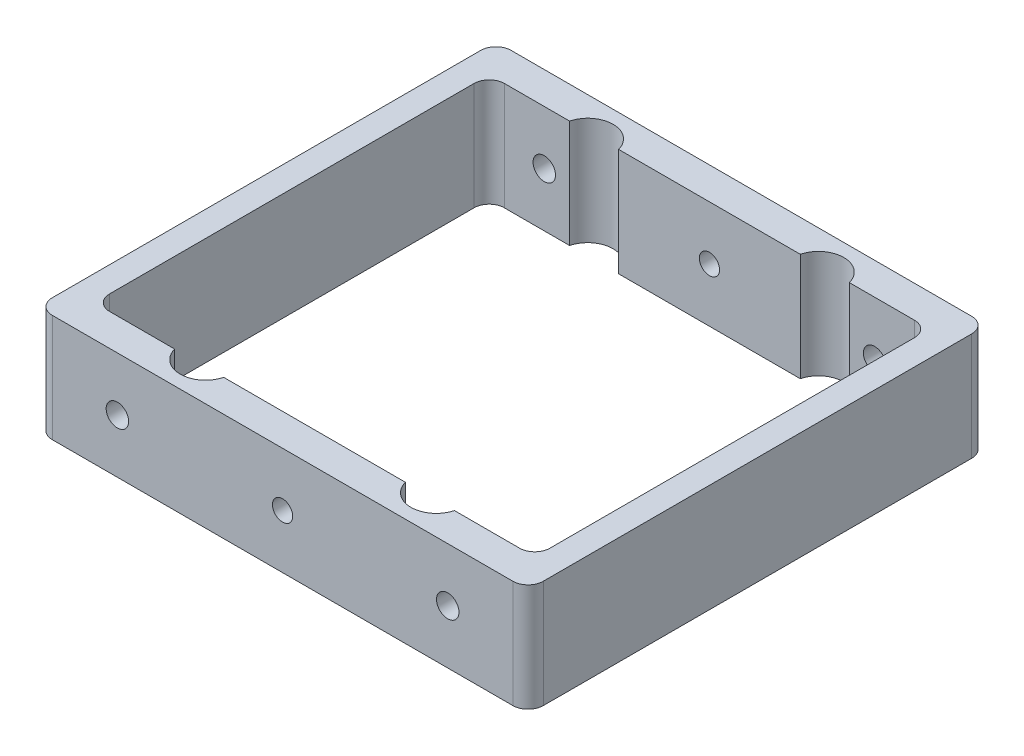
ISO-10303-21;
HEADER;
FILE_DESCRIPTION(('STEP AP214'),'2;1');
FILE_NAME('part.step','',(''),(''),'','','');
FILE_SCHEMA(('AUTOMOTIVE_DESIGN { 1 0 10303 214 1 1 1 1 }'));
ENDSEC;
DATA;
#1=APPLICATION_CONTEXT('core data for automotive mechanical design processes');
#2=APPLICATION_PROTOCOL_DEFINITION('international standard','automotive_design',2000,#1);
#3=PRODUCT_CONTEXT('',#1,'mechanical');
#4=PRODUCT('Part','Part','',(#3));
#5=PRODUCT_RELATED_PRODUCT_CATEGORY('part','',(#4));
#6=PRODUCT_DEFINITION_FORMATION('','',#4);
#7=PRODUCT_DEFINITION_CONTEXT('part definition',#1,'design');
#8=PRODUCT_DEFINITION('design','',#6,#7);
#9=PRODUCT_DEFINITION_SHAPE('','',#8);
#10=(LENGTH_UNIT() NAMED_UNIT(*) SI_UNIT(.MILLI.,.METRE.));
#11=(NAMED_UNIT(*) PLANE_ANGLE_UNIT() SI_UNIT($,.RADIAN.));
#12=(NAMED_UNIT(*) SI_UNIT($,.STERADIAN.) SOLID_ANGLE_UNIT());
#13=UNCERTAINTY_MEASURE_WITH_UNIT(LENGTH_MEASURE(1.E-05),#10,'distance_accuracy_value','');
#14=(GEOMETRIC_REPRESENTATION_CONTEXT(3) GLOBAL_UNCERTAINTY_ASSIGNED_CONTEXT((#13)) GLOBAL_UNIT_ASSIGNED_CONTEXT((#10,
#11,#12)) REPRESENTATION_CONTEXT('',''));
#15=CARTESIAN_POINT('',(0.,0.,0.));
#16=DIRECTION('',(0.,0.,1.));
#17=DIRECTION('',(1.,0.,0.));
#18=AXIS2_PLACEMENT_3D('',#15,#16,#17);
#19=CARTESIAN_POINT('',(-18.5,10.64,-78.01));
#20=DIRECTION('',(0.,0.,-1.));
#21=DIRECTION('',(-1.,0.,0.));
#22=AXIS2_PLACEMENT_3D('',#19,#20,#21);
#23=PLANE('',#22);
#24=CARTESIAN_POINT('',(-2.63122918275928,0.0049999999999998,-78.01));
#25=DIRECTION('',(0.,0.,-1.));
#26=DIRECTION('',(-1.,0.,0.));
#27=AXIS2_PLACEMENT_3D('',#24,#25,#26);
#28=CIRCLE('',#27,2.22000000000001);
#29=CARTESIAN_POINT('',(-4.85122918275928,0.0049999999999998,-78.01));
#30=VERTEX_POINT('',#29);
#31=EDGE_CURVE('E488',#30,#30,#28,.T.);
#32=ORIENTED_EDGE('',*,*,#31,.T.);
#33=EDGE_LOOP('',(#32));
#34=FACE_BOUND('',#33,.T.);
#35=DIRECTION('',(1.,0.,0.));
#36=VECTOR('',#35,1.);
#37=CARTESIAN_POINT('',(-18.5,10.64,-78.01));
#38=LINE('',#37,#36);
#39=CARTESIAN_POINT('',(-10.5,10.64,-78.01));
#40=VERTEX_POINT('',#39);
#41=CARTESIAN_POINT('',(2.36877081724072,10.64,-78.01));
#42=VERTEX_POINT('',#41);
#43=EDGE_CURVE('E256',#40,#42,#38,.T.);
#44=ORIENTED_EDGE('',*,*,#43,.F.);
#45=DIRECTION('',(0.,-1.,0.));
#46=VECTOR('',#45,1.);
#47=CARTESIAN_POINT('',(-10.5,-10.64,-78.01));
#48=LINE('',#47,#46);
#49=CARTESIAN_POINT('',(-10.5,-10.64,-78.01));
#50=VERTEX_POINT('',#49);
#51=EDGE_CURVE('E358',#40,#50,#48,.T.);
#52=ORIENTED_EDGE('',*,*,#51,.T.);
#53=DIRECTION('',(-1.,0.,0.));
#54=VECTOR('',#53,1.);
#55=CARTESIAN_POINT('',(0.,-10.64,-78.01));
#56=LINE('',#55,#54);
#57=CARTESIAN_POINT('',(-18.5,-10.64,-78.01));
#58=VERTEX_POINT('',#57);
#59=EDGE_CURVE('E269',#50,#58,#56,.T.);
#60=ORIENTED_EDGE('',*,*,#59,.T.);
#61=DIRECTION('',(0.,1.,0.));
#62=VECTOR('',#61,1.);
#63=CARTESIAN_POINT('',(-18.5,10.64,-78.01));
#64=LINE('',#63,#62);
#65=CARTESIAN_POINT('',(-18.5,-10.6519547348682,-78.01));
#66=VERTEX_POINT('',#65);
#67=EDGE_CURVE('E254',#66,#58,#64,.T.);
#68=ORIENTED_EDGE('',*,*,#67,.F.);
#69=DIRECTION('',(1.,0.,0.));
#70=VECTOR('',#69,1.);
#71=CARTESIAN_POINT('',(-18.5,-10.6519547348682,-78.01));
#72=LINE('',#71,#70);
#73=CARTESIAN_POINT('',(2.36877081724072,-10.6519547348682,-78.01));
#74=VERTEX_POINT('',#73);
#75=EDGE_CURVE('E265',#66,#74,#72,.T.);
#76=ORIENTED_EDGE('',*,*,#75,.T.);
#77=DIRECTION('',(0.,1.,0.));
#78=VECTOR('',#77,1.);
#79=CARTESIAN_POINT('',(2.36877081724072,-10.6519547348682,-78.01));
#80=LINE('',#79,#78);
#81=EDGE_CURVE('E356',#74,#42,#80,.T.);
#82=ORIENTED_EDGE('',*,*,#81,.T.);
#83=EDGE_LOOP('',(#44,#52,#60,#68,#76,#82));
#84=FACE_BOUND('',#83,.T.);
#85=ADVANCED_FACE('F47',(#34,#84),#23,.F.);
#86=CARTESIAN_POINT('',(30.,0.0049999999999998,-78.01));
#87=DIRECTION('',(0.,0.,-1.));
#88=DIRECTION('',(-1.,0.,0.));
#89=AXIS2_PLACEMENT_3D('',#86,#87,#88);
#90=CIRCLE('',#89,2.);
#91=CARTESIAN_POINT('',(28.,0.0049999999999998,-78.01));
#92=VERTEX_POINT('',#91);
#93=EDGE_CURVE('E505',#92,#92,#90,.T.);
#94=ORIENTED_EDGE('',*,*,#93,.T.);
#95=EDGE_LOOP('',(#94));
#96=FACE_BOUND('',#95,.T.);
#97=CARTESIAN_POINT('',(12.0512291827593,10.64,-78.01));
#98=VERTEX_POINT('',#97);
#99=CARTESIAN_POINT('',(47.9487708172407,10.64,-78.01));
#100=VERTEX_POINT('',#99);
#101=EDGE_CURVE('E247',#98,#100,#38,.T.);
#102=ORIENTED_EDGE('',*,*,#101,.F.);
#103=DIRECTION('',(0.,1.,0.));
#104=VECTOR('',#103,1.);
#105=CARTESIAN_POINT('',(12.0512291827593,-10.6519547348682,-78.01));
#106=LINE('',#105,#104);
#107=CARTESIAN_POINT('',(12.0512291827593,-10.6519547348682,-78.01));
#108=VERTEX_POINT('',#107);
#109=EDGE_CURVE('E353',#98,#108,#106,.F.);
#110=ORIENTED_EDGE('',*,*,#109,.T.);
#111=CARTESIAN_POINT('',(47.9487708172407,-10.6519547348682,-78.01));
#112=VERTEX_POINT('',#111);
#113=EDGE_CURVE('E264',#108,#112,#72,.T.);
#114=ORIENTED_EDGE('',*,*,#113,.T.);
#115=DIRECTION('',(0.,1.,0.));
#116=VECTOR('',#115,1.);
#117=CARTESIAN_POINT('',(47.9487708172407,-10.6519547348682,-78.01));
#118=LINE('',#117,#116);
#119=EDGE_CURVE('E236',#112,#100,#118,.T.);
#120=ORIENTED_EDGE('',*,*,#119,.T.);
#121=EDGE_LOOP('',(#102,#110,#114,#120));
#122=FACE_BOUND('',#121,.T.);
#123=ADVANCED_FACE('F564',(#96,#122),#23,.F.);
#124=CARTESIAN_POINT('',(0.,-10.64,0.));
#125=DIRECTION('',(0.,1.,0.));
#126=DIRECTION('',(0.,0.,1.));
#127=AXIS2_PLACEMENT_3D('',#124,#125,#126);
#128=PLANE('',#127);
#129=DIRECTION('',(1.,0.,0.));
#130=VECTOR('',#129,1.);
#131=CARTESIAN_POINT('',(0.,-10.64,6.32));
#132=LINE('',#131,#130);
#133=CARTESIAN_POINT('',(-15.5,-10.64,6.32));
#134=VERTEX_POINT('',#133);
#135=CARTESIAN_POINT('',(75.5,-10.64,6.32));
#136=VERTEX_POINT('',#135);
#137=EDGE_CURVE('E332',#134,#136,#132,.T.);
#138=ORIENTED_EDGE('',*,*,#137,.F.);
#139=CARTESIAN_POINT('',(-15.5,-10.64,3.32));
#140=DIRECTION('',(0.,1.,0.));
#141=DIRECTION('',(0.,0.,1.));
#142=AXIS2_PLACEMENT_3D('',#139,#140,#141);
#143=CIRCLE('',#142,3.);
#144=CARTESIAN_POINT('',(-18.5,-10.64,3.32));
#145=VERTEX_POINT('',#144);
#146=EDGE_CURVE('E414',#134,#145,#143,.F.);
#147=ORIENTED_EDGE('',*,*,#146,.T.);
#148=DIRECTION('',(0.,0.,1.));
#149=VECTOR('',#148,1.);
#150=CARTESIAN_POINT('',(-18.5,-10.64,0.));
#151=LINE('',#150,#149);
#152=EDGE_CURVE('E304',#58,#145,#151,.T.);
#153=ORIENTED_EDGE('',*,*,#152,.F.);
#154=ORIENTED_EDGE('',*,*,#59,.F.);
#155=CARTESIAN_POINT('',(-10.5,-10.64,-75.01));
#156=DIRECTION('',(0.,1.,0.));
#157=DIRECTION('',(0.,0.,1.));
#158=AXIS2_PLACEMENT_3D('',#155,#156,#157);
#159=CIRCLE('',#158,3.);
#160=CARTESIAN_POINT('',(-13.5,-10.64,-75.01));
#161=VERTEX_POINT('',#160);
#162=EDGE_CURVE('E416',#50,#161,#159,.T.);
#163=ORIENTED_EDGE('',*,*,#162,.T.);
#164=DIRECTION('',(0.,0.,1.));
#165=VECTOR('',#164,1.);
#166=CARTESIAN_POINT('',(-13.5,-10.64,-84.33));
#167=LINE('',#166,#165);
#168=CARTESIAN_POINT('',(-13.5,-10.64,-3.));
#169=VERTEX_POINT('',#168);
#170=EDGE_CURVE('E298',#161,#169,#167,.T.);
#171=ORIENTED_EDGE('',*,*,#170,.T.);
#172=CARTESIAN_POINT('',(-10.5,-10.64,-3.));
#173=DIRECTION('',(0.,1.,0.));
#174=DIRECTION('',(0.,0.,1.));
#175=AXIS2_PLACEMENT_3D('',#172,#173,#174);
#176=CIRCLE('',#175,3.);
#177=CARTESIAN_POINT('',(-10.5,-10.64,0.));
#178=VERTEX_POINT('',#177);
#179=EDGE_CURVE('E420',#169,#178,#176,.T.);
#180=ORIENTED_EDGE('',*,*,#179,.T.);
#181=DIRECTION('',(-1.,0.,0.));
#182=VECTOR('',#181,1.);
#183=CARTESIAN_POINT('',(0.,-10.64,0.));
#184=LINE('',#183,#182);
#185=CARTESIAN_POINT('',(2.36877081724073,-10.64,0.));
#186=VERTEX_POINT('',#185);
#187=EDGE_CURVE('E343',#186,#178,#184,.T.);
#188=ORIENTED_EDGE('',*,*,#187,.F.);
#189=CARTESIAN_POINT('',(7.21,-10.64,-1.25));
#190=DIRECTION('',(0.,1.,0.));
#191=DIRECTION('',(0.,0.,1.));
#192=AXIS2_PLACEMENT_3D('',#189,#190,#191);
#193=CIRCLE('',#192,5.);
#194=CARTESIAN_POINT('',(12.0512291827593,-10.64,0.));
#195=VERTEX_POINT('',#194);
#196=EDGE_CURVE('E237',#186,#195,#193,.T.);
#197=ORIENTED_EDGE('',*,*,#196,.T.);
#198=CARTESIAN_POINT('',(47.9487708172407,-10.64,0.));
#199=VERTEX_POINT('',#198);
#200=EDGE_CURVE('E347',#199,#195,#184,.T.);
#201=ORIENTED_EDGE('',*,*,#200,.F.);
#202=CARTESIAN_POINT('',(52.79,-10.64,-1.25));
#203=DIRECTION('',(0.,1.,0.));
#204=DIRECTION('',(0.,0.,1.));
#205=AXIS2_PLACEMENT_3D('',#202,#203,#204);
#206=CIRCLE('',#205,5.);
#207=CARTESIAN_POINT('',(57.6312291827593,-10.64,0.));
#208=VERTEX_POINT('',#207);
#209=EDGE_CURVE('E340',#199,#208,#206,.T.);
#210=ORIENTED_EDGE('',*,*,#209,.T.);
#211=CARTESIAN_POINT('',(70.5,-10.64,0.));
#212=VERTEX_POINT('',#211);
#213=EDGE_CURVE('E346',#212,#208,#184,.T.);
#214=ORIENTED_EDGE('',*,*,#213,.F.);
#215=CARTESIAN_POINT('',(70.5,-10.64,-3.));
#216=DIRECTION('',(0.,1.,0.));
#217=DIRECTION('',(0.,0.,1.));
#218=AXIS2_PLACEMENT_3D('',#215,#216,#217);
#219=CIRCLE('',#218,3.);
#220=CARTESIAN_POINT('',(73.5,-10.64,-3.));
#221=VERTEX_POINT('',#220);
#222=EDGE_CURVE('E12',#212,#221,#219,.T.);
#223=ORIENTED_EDGE('',*,*,#222,.T.);
#224=DIRECTION('',(0.,0.,-1.));
#225=VECTOR('',#224,1.);
#226=CARTESIAN_POINT('',(73.5,-10.64,0.));
#227=LINE('',#226,#225);
#228=CARTESIAN_POINT('',(73.5,-10.64,0.));
#229=VERTEX_POINT('',#228);
#230=EDGE_CURVE('E61',#229,#221,#227,.T.);
#231=ORIENTED_EDGE('',*,*,#230,.F.);
#232=CARTESIAN_POINT('',(78.5,-10.64,0.));
#233=VERTEX_POINT('',#232);
#234=EDGE_CURVE('E337',#233,#229,#184,.T.);
#235=ORIENTED_EDGE('',*,*,#234,.F.);
#236=DIRECTION('',(0.,0.,-1.));
#237=VECTOR('',#236,1.);
#238=CARTESIAN_POINT('',(78.5,-10.64,6.32));
#239=LINE('',#238,#237);
#240=CARTESIAN_POINT('',(78.5,-10.64,3.32));
#241=VERTEX_POINT('',#240);
#242=EDGE_CURVE('E310',#241,#233,#239,.T.);
#243=ORIENTED_EDGE('',*,*,#242,.F.);
#244=CARTESIAN_POINT('',(75.5,-10.64,3.32));
#245=DIRECTION('',(0.,1.,0.));
#246=DIRECTION('',(0.,0.,1.));
#247=AXIS2_PLACEMENT_3D('',#244,#245,#246);
#248=CIRCLE('',#247,3.);
#249=EDGE_CURVE('E68',#241,#136,#248,.F.);
#250=ORIENTED_EDGE('',*,*,#249,.T.);
#251=EDGE_LOOP('',(#138,#147,#153,#154,#163,#171,#180,#188,#197,#201,#210,#214,#223,#231,#235,
#243,#250));
#252=FACE_BOUND('',#251,.T.);
#253=ADVANCED_FACE('F439',(#252),#128,.F.);
#254=CARTESIAN_POINT('',(-13.5,10.64,-84.33));
#255=DIRECTION('',(-1.,0.,0.));
#256=DIRECTION('',(0.,-1.,0.));
#257=AXIS2_PLACEMENT_3D('',#254,#255,#256);
#258=PLANE('',#257);
#259=ORIENTED_EDGE('',*,*,#170,.F.);
#260=DIRECTION('',(0.,-1.,0.));
#261=VECTOR('',#260,1.);
#262=CARTESIAN_POINT('',(-13.5,10.64,-75.01));
#263=LINE('',#262,#261);
#264=CARTESIAN_POINT('',(-13.5,10.64,-75.01));
#265=VERTEX_POINT('',#264);
#266=EDGE_CURVE('E368',#161,#265,#263,.F.);
#267=ORIENTED_EDGE('',*,*,#266,.T.);
#268=DIRECTION('',(0.,0.,1.));
#269=VECTOR('',#268,1.);
#270=CARTESIAN_POINT('',(-13.5,10.64,-84.33));
#271=LINE('',#270,#269);
#272=CARTESIAN_POINT('',(-13.5,10.64,-3.));
#273=VERTEX_POINT('',#272);
#274=EDGE_CURVE('E301',#265,#273,#271,.T.);
#275=ORIENTED_EDGE('',*,*,#274,.T.);
#276=DIRECTION('',(0.,-1.,0.));
#277=VECTOR('',#276,1.);
#278=CARTESIAN_POINT('',(-13.5,-10.64,-3.));
#279=LINE('',#278,#277);
#280=EDGE_CURVE('E365',#273,#169,#279,.T.);
#281=ORIENTED_EDGE('',*,*,#280,.T.);
#282=EDGE_LOOP('',(#259,#267,#275,#281));
#283=FACE_BOUND('',#282,.T.);
#284=ADVANCED_FACE('F556',(#283),#258,.F.);
#285=CARTESIAN_POINT('',(73.5,10.64,-84.33));
#286=DIRECTION('',(1.,0.,0.));
#287=DIRECTION('',(0.,0.,-1.));
#288=AXIS2_PLACEMENT_3D('',#285,#286,#287);
#289=PLANE('',#288);
#290=DIRECTION('',(0.,0.,1.));
#291=VECTOR('',#290,1.);
#292=CARTESIAN_POINT('',(73.5,10.64,-84.33));
#293=LINE('',#292,#291);
#294=CARTESIAN_POINT('',(73.5,10.64,-75.01));
#295=VERTEX_POINT('',#294);
#296=CARTESIAN_POINT('',(73.5,10.64,-3.));
#297=VERTEX_POINT('',#296);
#298=EDGE_CURVE('E283',#295,#297,#293,.T.);
#299=ORIENTED_EDGE('',*,*,#298,.F.);
#300=DIRECTION('',(0.,1.,0.));
#301=VECTOR('',#300,1.);
#302=CARTESIAN_POINT('',(73.5,-10.6519547348682,-75.01));
#303=LINE('',#302,#301);
#304=CARTESIAN_POINT('',(73.5,-10.6519547348682,-75.01));
#305=VERTEX_POINT('',#304);
#306=EDGE_CURVE('E377',#295,#305,#303,.F.);
#307=ORIENTED_EDGE('',*,*,#306,.T.);
#308=DIRECTION('',(0.,0.,1.));
#309=VECTOR('',#308,1.);
#310=CARTESIAN_POINT('',(73.5,-10.6519547348682,-84.33));
#311=LINE('',#310,#309);
#312=CARTESIAN_POINT('',(73.5,-10.6519547348682,0.));
#313=VERTEX_POINT('',#312);
#314=EDGE_CURVE('E291',#305,#313,#311,.T.);
#315=ORIENTED_EDGE('',*,*,#314,.T.);
#316=DIRECTION('',(0.,1.,0.));
#317=VECTOR('',#316,1.);
#318=CARTESIAN_POINT('',(73.5,10.64,0.));
#319=LINE('',#318,#317);
#320=EDGE_CURVE('E284',#313,#229,#319,.T.);
#321=ORIENTED_EDGE('',*,*,#320,.T.);
#322=ORIENTED_EDGE('',*,*,#230,.T.);
#323=DIRECTION('',(0.,1.,0.));
#324=VECTOR('',#323,1.);
#325=CARTESIAN_POINT('',(73.5,10.64,-3.));
#326=LINE('',#325,#324);
#327=EDGE_CURVE('E374',#221,#297,#326,.T.);
#328=ORIENTED_EDGE('',*,*,#327,.T.);
#329=EDGE_LOOP('',(#299,#307,#315,#321,#322,#328));
#330=FACE_BOUND('',#329,.T.);
#331=ADVANCED_FACE('F441',(#330),#289,.F.);
#332=CARTESIAN_POINT('',(0.,10.64,0.));
#333=DIRECTION('',(0.,0.,1.));
#334=DIRECTION('',(1.,0.,0.));
#335=AXIS2_PLACEMENT_3D('',#332,#333,#334);
#336=PLANE('',#335);
#337=CARTESIAN_POINT('',(62.6312291827593,0.0049999999999998,0.));
#338=DIRECTION('',(0.,0.,1.));
#339=DIRECTION('',(1.,0.,0.));
#340=AXIS2_PLACEMENT_3D('',#337,#338,#339);
#341=CIRCLE('',#340,2.22000000000001);
#342=CARTESIAN_POINT('',(64.8512291827593,0.0049999999999998,0.));
#343=VERTEX_POINT('',#342);
#344=EDGE_CURVE('E362',#343,#343,#341,.T.);
#345=ORIENTED_EDGE('',*,*,#344,.T.);
#346=EDGE_LOOP('',(#345));
#347=FACE_BOUND('',#346,.T.);
#348=DIRECTION('',(-1.,0.,0.));
#349=VECTOR('',#348,1.);
#350=CARTESIAN_POINT('',(0.,10.64,0.));
#351=LINE('',#350,#349);
#352=CARTESIAN_POINT('',(70.5,10.64,0.));
#353=VERTEX_POINT('',#352);
#354=CARTESIAN_POINT('',(57.6312291827593,10.64,0.));
#355=VERTEX_POINT('',#354);
#356=EDGE_CURVE('E338',#353,#355,#351,.T.);
#357=ORIENTED_EDGE('',*,*,#356,.F.);
#358=DIRECTION('',(0.,1.,0.));
#359=VECTOR('',#358,1.);
#360=CARTESIAN_POINT('',(70.5,-10.64,0.));
#361=LINE('',#360,#359);
#362=EDGE_CURVE('E379',#353,#212,#361,.F.);
#363=ORIENTED_EDGE('',*,*,#362,.T.);
#364=ORIENTED_EDGE('',*,*,#213,.T.);
#365=DIRECTION('',(0.,1.,0.));
#366=VECTOR('',#365,1.);
#367=CARTESIAN_POINT('',(57.6312291827593,-10.64,0.));
#368=LINE('',#367,#366);
#369=EDGE_CURVE('E323',#208,#355,#368,.T.);
#370=ORIENTED_EDGE('',*,*,#369,.T.);
#371=EDGE_LOOP('',(#357,#363,#364,#370));
#372=FACE_BOUND('',#371,.T.);
#373=ADVANCED_FACE('F434',(#347,#372),#336,.F.);
#374=CARTESIAN_POINT('',(-2.63122918275928,0.0049999999999998,0.));
#375=DIRECTION('',(0.,0.,1.));
#376=DIRECTION('',(1.,0.,0.));
#377=AXIS2_PLACEMENT_3D('',#374,#375,#376);
#378=CIRCLE('',#377,2.22000000000001);
#379=CARTESIAN_POINT('',(-0.411229182759274,0.0049999999999998,0.));
#380=VERTEX_POINT('',#379);
#381=EDGE_CURVE('E492',#380,#380,#378,.T.);
#382=ORIENTED_EDGE('',*,*,#381,.T.);
#383=EDGE_LOOP('',(#382));
#384=FACE_BOUND('',#383,.T.);
#385=ORIENTED_EDGE('',*,*,#187,.T.);
#386=DIRECTION('',(0.,-1.,0.));
#387=VECTOR('',#386,1.);
#388=CARTESIAN_POINT('',(-10.5,10.64,0.));
#389=LINE('',#388,#387);
#390=CARTESIAN_POINT('',(-10.5,10.64,0.));
#391=VERTEX_POINT('',#390);
#392=EDGE_CURVE('E370',#178,#391,#389,.F.);
#393=ORIENTED_EDGE('',*,*,#392,.T.);
#394=CARTESIAN_POINT('',(2.36877081724073,10.64,0.));
#395=VERTEX_POINT('',#394);
#396=EDGE_CURVE('E336',#395,#391,#351,.T.);
#397=ORIENTED_EDGE('',*,*,#396,.F.);
#398=DIRECTION('',(0.,1.,0.));
#399=VECTOR('',#398,1.);
#400=CARTESIAN_POINT('',(2.36877081724073,-10.64,0.));
#401=LINE('',#400,#399);
#402=EDGE_CURVE('E326',#395,#186,#401,.F.);
#403=ORIENTED_EDGE('',*,*,#402,.T.);
#404=EDGE_LOOP('',(#385,#393,#397,#403));
#405=FACE_BOUND('',#404,.T.);
#406=ADVANCED_FACE('F537',(#384,#405),#336,.F.);
#407=CARTESIAN_POINT('',(30.,0.0049999999999998,0.));
#408=DIRECTION('',(0.,0.,1.));
#409=DIRECTION('',(1.,0.,0.));
#410=AXIS2_PLACEMENT_3D('',#407,#408,#409);
#411=CIRCLE('',#410,2.);
#412=CARTESIAN_POINT('',(32.,0.0049999999999998,0.));
#413=VERTEX_POINT('',#412);
#414=EDGE_CURVE('E515',#413,#413,#411,.T.);
#415=ORIENTED_EDGE('',*,*,#414,.T.);
#416=EDGE_LOOP('',(#415));
#417=FACE_BOUND('',#416,.T.);
#418=ORIENTED_EDGE('',*,*,#200,.T.);
#419=DIRECTION('',(0.,1.,0.));
#420=VECTOR('',#419,1.);
#421=CARTESIAN_POINT('',(12.0512291827593,-10.64,0.));
#422=LINE('',#421,#420);
#423=CARTESIAN_POINT('',(12.0512291827593,10.64,0.));
#424=VERTEX_POINT('',#423);
#425=EDGE_CURVE('E329',#195,#424,#422,.T.);
#426=ORIENTED_EDGE('',*,*,#425,.T.);
#427=CARTESIAN_POINT('',(47.9487708172407,10.64,0.));
#428=VERTEX_POINT('',#427);
#429=EDGE_CURVE('E341',#428,#424,#351,.T.);
#430=ORIENTED_EDGE('',*,*,#429,.F.);
#431=DIRECTION('',(0.,1.,0.));
#432=VECTOR('',#431,1.);
#433=CARTESIAN_POINT('',(47.9487708172407,-10.64,0.));
#434=LINE('',#433,#432);
#435=EDGE_CURVE('E318',#428,#199,#434,.F.);
#436=ORIENTED_EDGE('',*,*,#435,.T.);
#437=EDGE_LOOP('',(#418,#426,#430,#436));
#438=FACE_BOUND('',#437,.T.);
#439=ADVANCED_FACE('F534',(#417,#438),#336,.F.);
#440=CARTESIAN_POINT('',(0.,10.64,6.32));
#441=DIRECTION('',(0.,0.,-1.));
#442=DIRECTION('',(-1.,0.,0.));
#443=AXIS2_PLACEMENT_3D('',#440,#441,#442);
#444=PLANE('',#443);
#445=CARTESIAN_POINT('',(30.,0.0049999999999998,6.32000000000001));
#446=DIRECTION('',(0.,0.,-1.));
#447=DIRECTION('',(-1.,0.,0.));
#448=AXIS2_PLACEMENT_3D('',#445,#446,#447);
#449=CIRCLE('',#448,2.);
#450=CARTESIAN_POINT('',(28.,0.0049999999999998,6.32000000000001));
#451=VERTEX_POINT('',#450);
#452=EDGE_CURVE('E518',#451,#451,#449,.T.);
#453=ORIENTED_EDGE('',*,*,#452,.T.);
#454=EDGE_LOOP('',(#453));
#455=FACE_BOUND('',#454,.T.);
#456=CARTESIAN_POINT('',(62.6312291827593,0.0049999999999998,6.32000000000001));
#457=DIRECTION('',(0.,0.,-1.));
#458=DIRECTION('',(-1.,0.,0.));
#459=AXIS2_PLACEMENT_3D('',#456,#457,#458);
#460=CIRCLE('',#459,2.22000000000001);
#461=CARTESIAN_POINT('',(60.4112291827593,0.0049999999999998,6.32000000000001));
#462=VERTEX_POINT('',#461);
#463=EDGE_CURVE('E363',#462,#462,#460,.T.);
#464=ORIENTED_EDGE('',*,*,#463,.T.);
#465=EDGE_LOOP('',(#464));
#466=FACE_BOUND('',#465,.T.);
#467=CARTESIAN_POINT('',(-2.63122918275928,0.0049999999999998,6.32000000000001));
#468=DIRECTION('',(0.,0.,-1.));
#469=DIRECTION('',(1.,0.,0.));
#470=AXIS2_PLACEMENT_3D('',#467,#468,#469);
#471=CIRCLE('',#470,2.22000000000001);
#472=CARTESIAN_POINT('',(-0.411229182759274,0.0049999999999998,6.32000000000001));
#473=VERTEX_POINT('',#472);
#474=EDGE_CURVE('E501',#473,#473,#471,.T.);
#475=ORIENTED_EDGE('',*,*,#474,.T.);
#476=EDGE_LOOP('',(#475));
#477=FACE_BOUND('',#476,.T.);
#478=DIRECTION('',(1.,0.,0.));
#479=VECTOR('',#478,1.);
#480=CARTESIAN_POINT('',(0.,10.64,6.32));
#481=LINE('',#480,#479);
#482=CARTESIAN_POINT('',(-15.5,10.64,6.32));
#483=VERTEX_POINT('',#482);
#484=CARTESIAN_POINT('',(75.5,10.64,6.32));
#485=VERTEX_POINT('',#484);
#486=EDGE_CURVE('E333',#483,#485,#481,.T.);
#487=ORIENTED_EDGE('',*,*,#486,.F.);
#488=DIRECTION('',(0.,1.,0.));
#489=VECTOR('',#488,1.);
#490=CARTESIAN_POINT('',(-15.5,-10.64,6.32));
#491=LINE('',#490,#489);
#492=EDGE_CURVE('E411',#483,#134,#491,.F.);
#493=ORIENTED_EDGE('',*,*,#492,.T.);
#494=ORIENTED_EDGE('',*,*,#137,.T.);
#495=DIRECTION('',(0.,-1.,0.));
#496=VECTOR('',#495,1.);
#497=CARTESIAN_POINT('',(75.5,10.64,6.32));
#498=LINE('',#497,#496);
#499=EDGE_CURVE('E409',#136,#485,#498,.F.);
#500=ORIENTED_EDGE('',*,*,#499,.T.);
#501=EDGE_LOOP('',(#487,#493,#494,#500));
#502=FACE_BOUND('',#501,.T.);
#503=ADVANCED_FACE('F458',(#455,#466,#477,#502),#444,.F.);
#504=CARTESIAN_POINT('',(0.,10.64,0.));
#505=DIRECTION('',(0.,1.,0.));
#506=DIRECTION('',(0.,0.,1.));
#507=AXIS2_PLACEMENT_3D('',#504,#505,#506);
#508=PLANE('',#507);
#509=CARTESIAN_POINT('',(7.21,10.64,-76.76));
#510=DIRECTION('',(0.,1.,0.));
#511=DIRECTION('',(0.,0.,1.));
#512=AXIS2_PLACEMENT_3D('',#509,#510,#511);
#513=CIRCLE('',#512,5.);
#514=EDGE_CURVE('E248',#98,#42,#513,.T.);
#515=ORIENTED_EDGE('',*,*,#514,.F.);
#516=ORIENTED_EDGE('',*,*,#101,.T.);
#517=CARTESIAN_POINT('',(52.79,10.64,-76.76));
#518=DIRECTION('',(0.,1.,0.));
#519=DIRECTION('',(0.,0.,1.));
#520=AXIS2_PLACEMENT_3D('',#517,#518,#519);
#521=CIRCLE('',#520,5.);
#522=CARTESIAN_POINT('',(57.6312291827593,10.64,-78.01));
#523=VERTEX_POINT('',#522);
#524=EDGE_CURVE('E228',#523,#100,#521,.T.);
#525=ORIENTED_EDGE('',*,*,#524,.F.);
#526=CARTESIAN_POINT('',(70.5,10.64,-78.01));
#527=VERTEX_POINT('',#526);
#528=EDGE_CURVE('E245',#523,#527,#38,.T.);
#529=ORIENTED_EDGE('',*,*,#528,.T.);
#530=CARTESIAN_POINT('',(70.5,10.64,-75.01));
#531=DIRECTION('',(0.,1.,0.));
#532=DIRECTION('',(0.,0.,1.));
#533=AXIS2_PLACEMENT_3D('',#530,#531,#532);
#534=CIRCLE('',#533,3.);
#535=EDGE_CURVE('E424',#527,#295,#534,.F.);
#536=ORIENTED_EDGE('',*,*,#535,.T.);
#537=ORIENTED_EDGE('',*,*,#298,.T.);
#538=CARTESIAN_POINT('',(70.5,10.64,-3.));
#539=DIRECTION('',(0.,1.,0.));
#540=DIRECTION('',(0.,0.,1.));
#541=AXIS2_PLACEMENT_3D('',#538,#539,#540);
#542=CIRCLE('',#541,3.);
#543=EDGE_CURVE('E55',#297,#353,#542,.F.);
#544=ORIENTED_EDGE('',*,*,#543,.T.);
#545=ORIENTED_EDGE('',*,*,#356,.T.);
#546=CARTESIAN_POINT('',(52.79,10.64,-1.25));
#547=DIRECTION('',(0.,1.,0.));
#548=DIRECTION('',(0.,0.,1.));
#549=AXIS2_PLACEMENT_3D('',#546,#547,#548);
#550=CIRCLE('',#549,5.);
#551=EDGE_CURVE('E315',#428,#355,#550,.T.);
#552=ORIENTED_EDGE('',*,*,#551,.F.);
#553=ORIENTED_EDGE('',*,*,#429,.T.);
#554=CARTESIAN_POINT('',(7.21,10.64,-1.25));
#555=DIRECTION('',(0.,1.,0.));
#556=DIRECTION('',(0.,0.,1.));
#557=AXIS2_PLACEMENT_3D('',#554,#555,#556);
#558=CIRCLE('',#557,5.);
#559=EDGE_CURVE('E316',#395,#424,#558,.T.);
#560=ORIENTED_EDGE('',*,*,#559,.F.);
#561=ORIENTED_EDGE('',*,*,#396,.T.);
#562=CARTESIAN_POINT('',(-10.5,10.64,-3.));
#563=DIRECTION('',(0.,1.,0.));
#564=DIRECTION('',(0.,0.,1.));
#565=AXIS2_PLACEMENT_3D('',#562,#563,#564);
#566=CIRCLE('',#565,3.);
#567=EDGE_CURVE('E422',#391,#273,#566,.F.);
#568=ORIENTED_EDGE('',*,*,#567,.T.);
#569=ORIENTED_EDGE('',*,*,#274,.F.);
#570=CARTESIAN_POINT('',(-10.5,10.64,-75.01));
#571=DIRECTION('',(0.,1.,0.));
#572=DIRECTION('',(0.,0.,1.));
#573=AXIS2_PLACEMENT_3D('',#570,#571,#572);
#574=CIRCLE('',#573,3.);
#575=EDGE_CURVE('E418',#265,#40,#574,.F.);
#576=ORIENTED_EDGE('',*,*,#575,.T.);
#577=ORIENTED_EDGE('',*,*,#43,.T.);
#578=EDGE_LOOP('',(#515,#516,#525,#529,#536,#537,#544,#545,#552,#553,#560,#561,#568,#569,#576,#577));
#579=FACE_BOUND('',#578,.T.);
#580=DIRECTION('',(0.,0.,1.));
#581=VECTOR('',#580,1.);
#582=CARTESIAN_POINT('',(78.5,10.64,6.32));
#583=LINE('',#582,#581);
#584=CARTESIAN_POINT('',(78.5,10.64,-81.33));
#585=VERTEX_POINT('',#584);
#586=CARTESIAN_POINT('',(78.5,10.64,3.32));
#587=VERTEX_POINT('',#586);
#588=EDGE_CURVE('E312',#585,#587,#583,.T.);
#589=ORIENTED_EDGE('',*,*,#588,.F.);
#590=CARTESIAN_POINT('',(75.5,10.64,-81.33));
#591=DIRECTION('',(0.,1.,0.));
#592=DIRECTION('',(0.,0.,1.));
#593=AXIS2_PLACEMENT_3D('',#590,#591,#592);
#594=CIRCLE('',#593,3.);
#595=CARTESIAN_POINT('',(75.5,10.64,-84.33));
#596=VERTEX_POINT('',#595);
#597=EDGE_CURVE('E402',#585,#596,#594,.T.);
#598=ORIENTED_EDGE('',*,*,#597,.T.);
#599=DIRECTION('',(1.,0.,0.));
#600=VECTOR('',#599,1.);
#601=CARTESIAN_POINT('',(-18.5,10.64,-84.33));
#602=LINE('',#601,#600);
#603=CARTESIAN_POINT('',(-15.5,10.64,-84.33));
#604=VERTEX_POINT('',#603);
#605=EDGE_CURVE('E295',#604,#596,#602,.T.);
#606=ORIENTED_EDGE('',*,*,#605,.F.);
#607=CARTESIAN_POINT('',(-15.5,10.64,-81.33));
#608=DIRECTION('',(0.,1.,0.));
#609=DIRECTION('',(0.,0.,1.));
#610=AXIS2_PLACEMENT_3D('',#607,#608,#609);
#611=CIRCLE('',#610,3.);
#612=CARTESIAN_POINT('',(-18.5,10.64,-81.33));
#613=VERTEX_POINT('',#612);
#614=EDGE_CURVE('E400',#604,#613,#611,.T.);
#615=ORIENTED_EDGE('',*,*,#614,.T.);
#616=DIRECTION('',(0.,0.,-1.));
#617=VECTOR('',#616,1.);
#618=CARTESIAN_POINT('',(-18.5,10.64,0.));
#619=LINE('',#618,#617);
#620=CARTESIAN_POINT('',(-18.5,10.64,3.32));
#621=VERTEX_POINT('',#620);
#622=EDGE_CURVE('E307',#621,#613,#619,.T.);
#623=ORIENTED_EDGE('',*,*,#622,.F.);
#624=CARTESIAN_POINT('',(-15.5,10.64,3.32));
#625=DIRECTION('',(0.,1.,0.));
#626=DIRECTION('',(0.,0.,1.));
#627=AXIS2_PLACEMENT_3D('',#624,#625,#626);
#628=CIRCLE('',#627,3.);
#629=EDGE_CURVE('E398',#621,#483,#628,.T.);
#630=ORIENTED_EDGE('',*,*,#629,.T.);
#631=ORIENTED_EDGE('',*,*,#486,.T.);
#632=CARTESIAN_POINT('',(75.5,10.64,3.32));
#633=DIRECTION('',(0.,1.,0.));
#634=DIRECTION('',(0.,0.,1.));
#635=AXIS2_PLACEMENT_3D('',#632,#633,#634);
#636=CIRCLE('',#635,3.);
#637=EDGE_CURVE('E396',#485,#587,#636,.T.);
#638=ORIENTED_EDGE('',*,*,#637,.T.);
#639=EDGE_LOOP('',(#589,#598,#606,#615,#623,#630,#631,#638));
#640=FACE_BOUND('',#639,.T.);
#641=ADVANCED_FACE('F243',(#579,#640),#508,.T.);
#642=CARTESIAN_POINT('',(52.79,-10.64,-1.25));
#643=DIRECTION('',(0.,1.,0.));
#644=DIRECTION('',(0.,0.,1.));
#645=AXIS2_PLACEMENT_3D('',#642,#643,#644);
#646=CYLINDRICAL_SURFACE('',#645,5.);
#647=ORIENTED_EDGE('',*,*,#209,.F.);
#648=ORIENTED_EDGE('',*,*,#435,.F.);
#649=ORIENTED_EDGE('',*,*,#551,.T.);
#650=ORIENTED_EDGE('',*,*,#369,.F.);
#651=EDGE_LOOP('',(#647,#648,#649,#650));
#652=FACE_BOUND('',#651,.T.);
#653=ADVANCED_FACE('F677',(#652),#646,.F.);
#654=CARTESIAN_POINT('',(7.21,-10.64,-1.25));
#655=DIRECTION('',(0.,1.,0.));
#656=DIRECTION('',(0.,0.,1.));
#657=AXIS2_PLACEMENT_3D('',#654,#655,#656);
#658=CYLINDRICAL_SURFACE('',#657,5.);
#659=ORIENTED_EDGE('',*,*,#196,.F.);
#660=ORIENTED_EDGE('',*,*,#402,.F.);
#661=ORIENTED_EDGE('',*,*,#559,.T.);
#662=ORIENTED_EDGE('',*,*,#425,.F.);
#663=EDGE_LOOP('',(#659,#660,#661,#662));
#664=FACE_BOUND('',#663,.T.);
#665=ADVANCED_FACE('F672',(#664),#658,.F.);
#666=CARTESIAN_POINT('',(78.5,0.,0.));
#667=DIRECTION('',(1.,0.,0.));
#668=DIRECTION('',(0.,0.,-1.));
#669=AXIS2_PLACEMENT_3D('',#666,#667,#668);
#670=PLANE('',#669);
#671=DIRECTION('',(0.,0.,1.));
#672=VECTOR('',#671,1.);
#673=CARTESIAN_POINT('',(78.5,-10.6519547348682,-84.33));
#674=LINE('',#673,#672);
#675=CARTESIAN_POINT('',(78.5,-10.6519547348682,-81.33));
#676=VERTEX_POINT('',#675);
#677=CARTESIAN_POINT('',(78.5,-10.6519547348682,0.));
#678=VERTEX_POINT('',#677);
#679=EDGE_CURVE('E293',#676,#678,#674,.T.);
#680=ORIENTED_EDGE('',*,*,#679,.F.);
#681=DIRECTION('',(0.,-1.,0.));
#682=VECTOR('',#681,1.);
#683=CARTESIAN_POINT('',(78.5,10.64,-81.33));
#684=LINE('',#683,#682);
#685=EDGE_CURVE('E394',#676,#585,#684,.F.);
#686=ORIENTED_EDGE('',*,*,#685,.T.);
#687=ORIENTED_EDGE('',*,*,#588,.T.);
#688=DIRECTION('',(0.,-1.,0.));
#689=VECTOR('',#688,1.);
#690=CARTESIAN_POINT('',(78.5,-10.64,3.32));
#691=LINE('',#690,#689);
#692=EDGE_CURVE('E391',#587,#241,#691,.T.);
#693=ORIENTED_EDGE('',*,*,#692,.T.);
#694=ORIENTED_EDGE('',*,*,#242,.T.);
#695=DIRECTION('',(0.,-1.,0.));
#696=VECTOR('',#695,1.);
#697=CARTESIAN_POINT('',(78.5,10.64,0.));
#698=LINE('',#697,#696);
#699=EDGE_CURVE('E275',#233,#678,#698,.T.);
#700=ORIENTED_EDGE('',*,*,#699,.T.);
#701=EDGE_LOOP('',(#680,#686,#687,#693,#694,#700));
#702=FACE_BOUND('',#701,.T.);
#703=ADVANCED_FACE('F450',(#702),#670,.T.);
#704=CARTESIAN_POINT('',(-18.5,0.,0.));
#705=DIRECTION('',(-1.,0.,0.));
#706=DIRECTION('',(0.,0.,1.));
#707=AXIS2_PLACEMENT_3D('',#704,#705,#706);
#708=PLANE('',#707);
#709=ORIENTED_EDGE('',*,*,#622,.T.);
#710=DIRECTION('',(0.,1.,0.));
#711=VECTOR('',#710,1.);
#712=CARTESIAN_POINT('',(-18.5,-10.6519547348682,-81.33));
#713=LINE('',#712,#711);
#714=CARTESIAN_POINT('',(-18.5,-10.6519547348682,-81.33));
#715=VERTEX_POINT('',#714);
#716=EDGE_CURVE('E407',#613,#715,#713,.F.);
#717=ORIENTED_EDGE('',*,*,#716,.T.);
#718=DIRECTION('',(0.,0.,1.));
#719=VECTOR('',#718,1.);
#720=CARTESIAN_POINT('',(-18.5,-10.6519547348682,-84.33));
#721=LINE('',#720,#719);
#722=EDGE_CURVE('E258',#715,#66,#721,.T.);
#723=ORIENTED_EDGE('',*,*,#722,.T.);
#724=ORIENTED_EDGE('',*,*,#67,.T.);
#725=ORIENTED_EDGE('',*,*,#152,.T.);
#726=DIRECTION('',(0.,1.,0.));
#727=VECTOR('',#726,1.);
#728=CARTESIAN_POINT('',(-18.5,10.64,3.32));
#729=LINE('',#728,#727);
#730=EDGE_CURVE('E404',#145,#621,#729,.T.);
#731=ORIENTED_EDGE('',*,*,#730,.T.);
#732=EDGE_LOOP('',(#709,#717,#723,#724,#725,#731));
#733=FACE_BOUND('',#732,.T.);
#734=ADVANCED_FACE('F466',(#733),#708,.T.);
#735=CARTESIAN_POINT('',(0.,0.,-84.33));
#736=DIRECTION('',(0.,0.,1.));
#737=DIRECTION('',(1.,0.,0.));
#738=AXIS2_PLACEMENT_3D('',#735,#736,#737);
#739=PLANE('',#738);
#740=CARTESIAN_POINT('',(30.,0.0049999999999998,-84.33));
#741=DIRECTION('',(0.,0.,-1.));
#742=DIRECTION('',(-1.,0.,0.));
#743=AXIS2_PLACEMENT_3D('',#740,#741,#742);
#744=CIRCLE('',#743,2.);
#745=CARTESIAN_POINT('',(28.,0.0049999999999998,-84.33));
#746=VERTEX_POINT('',#745);
#747=EDGE_CURVE('E519',#746,#746,#744,.T.);
#748=ORIENTED_EDGE('',*,*,#747,.F.);
#749=EDGE_LOOP('',(#748));
#750=FACE_BOUND('',#749,.T.);
#751=CARTESIAN_POINT('',(62.6312291827593,0.0049999999999998,-84.33));
#752=DIRECTION('',(0.,0.,-1.));
#753=DIRECTION('',(-1.,0.,0.));
#754=AXIS2_PLACEMENT_3D('',#751,#752,#753);
#755=CIRCLE('',#754,2.22000000000001);
#756=CARTESIAN_POINT('',(60.4112291827593,0.0049999999999998,-84.33));
#757=VERTEX_POINT('',#756);
#758=EDGE_CURVE('E508',#757,#757,#755,.T.);
#759=ORIENTED_EDGE('',*,*,#758,.F.);
#760=EDGE_LOOP('',(#759));
#761=FACE_BOUND('',#760,.T.);
#762=CARTESIAN_POINT('',(-2.63122918275928,0.0049999999999998,-84.33));
#763=DIRECTION('',(0.,0.,-1.));
#764=DIRECTION('',(1.,0.,0.));
#765=AXIS2_PLACEMENT_3D('',#762,#763,#764);
#766=CIRCLE('',#765,2.22000000000001);
#767=CARTESIAN_POINT('',(-0.411229182759274,0.0049999999999998,-84.33));
#768=VERTEX_POINT('',#767);
#769=EDGE_CURVE('E504',#768,#768,#766,.T.);
#770=ORIENTED_EDGE('',*,*,#769,.F.);
#771=EDGE_LOOP('',(#770));
#772=FACE_BOUND('',#771,.T.);
#773=ORIENTED_EDGE('',*,*,#605,.T.);
#774=DIRECTION('',(0.,-1.,0.));
#775=VECTOR('',#774,1.);
#776=CARTESIAN_POINT('',(75.5,-10.6519547348682,-84.33));
#777=LINE('',#776,#775);
#778=CARTESIAN_POINT('',(75.5,-10.6519547348682,-84.33));
#779=VERTEX_POINT('',#778);
#780=EDGE_CURVE('E384',#596,#779,#777,.T.);
#781=ORIENTED_EDGE('',*,*,#780,.T.);
#782=DIRECTION('',(-1.,0.,0.));
#783=VECTOR('',#782,1.);
#784=CARTESIAN_POINT('',(78.5,-10.6519547348682,-84.33));
#785=LINE('',#784,#783);
#786=CARTESIAN_POINT('',(-15.5,-10.6519547348682,-84.33));
#787=VERTEX_POINT('',#786);
#788=EDGE_CURVE('E281',#779,#787,#785,.T.);
#789=ORIENTED_EDGE('',*,*,#788,.T.);
#790=DIRECTION('',(0.,1.,0.));
#791=VECTOR('',#790,1.);
#792=CARTESIAN_POINT('',(-15.5,10.64,-84.33));
#793=LINE('',#792,#791);
#794=EDGE_CURVE('E381',#787,#604,#793,.T.);
#795=ORIENTED_EDGE('',*,*,#794,.T.);
#796=EDGE_LOOP('',(#773,#781,#789,#795));
#797=FACE_BOUND('',#796,.T.);
#798=ADVANCED_FACE('F650',(#750,#761,#772,#797),#739,.F.);
#799=CARTESIAN_POINT('',(0.,0.,0.));
#800=DIRECTION('',(0.,0.,-1.));
#801=DIRECTION('',(-1.,0.,0.));
#802=AXIS2_PLACEMENT_3D('',#799,#800,#801);
#803=PLANE('',#802);
#804=ORIENTED_EDGE('',*,*,#699,.F.);
#805=ORIENTED_EDGE('',*,*,#234,.T.);
#806=ORIENTED_EDGE('',*,*,#320,.F.);
#807=DIRECTION('',(-1.,0.,0.));
#808=VECTOR('',#807,1.);
#809=CARTESIAN_POINT('',(78.5,-10.6519547348682,0.));
#810=LINE('',#809,#808);
#811=EDGE_CURVE('E278',#678,#313,#810,.T.);
#812=ORIENTED_EDGE('',*,*,#811,.F.);
#813=EDGE_LOOP('',(#804,#805,#806,#812));
#814=FACE_BOUND('',#813,.T.);
#815=ADVANCED_FACE('F447',(#814),#803,.F.);
#816=CARTESIAN_POINT('',(78.5,-10.6519547348682,-84.33));
#817=DIRECTION('',(0.,1.,0.));
#818=DIRECTION('',(0.,0.,1.));
#819=AXIS2_PLACEMENT_3D('',#816,#817,#818);
#820=PLANE('',#819);
#821=ORIENTED_EDGE('',*,*,#788,.F.);
#822=CARTESIAN_POINT('',(75.5,-10.6519547348682,-81.33));
#823=DIRECTION('',(0.,1.,0.));
#824=DIRECTION('',(0.,0.,1.));
#825=AXIS2_PLACEMENT_3D('',#822,#823,#824);
#826=CIRCLE('',#825,3.);
#827=EDGE_CURVE('E389',#779,#676,#826,.F.);
#828=ORIENTED_EDGE('',*,*,#827,.T.);
#829=ORIENTED_EDGE('',*,*,#679,.T.);
#830=ORIENTED_EDGE('',*,*,#811,.T.);
#831=ORIENTED_EDGE('',*,*,#314,.F.);
#832=CARTESIAN_POINT('',(70.5,-10.6519547348682,-75.01));
#833=DIRECTION('',(0.,1.,0.));
#834=DIRECTION('',(0.,0.,1.));
#835=AXIS2_PLACEMENT_3D('',#832,#833,#834);
#836=CIRCLE('',#835,3.);
#837=CARTESIAN_POINT('',(70.5,-10.6519547348682,-78.01));
#838=VERTEX_POINT('',#837);
#839=EDGE_CURVE('E426',#305,#838,#836,.T.);
#840=ORIENTED_EDGE('',*,*,#839,.T.);
#841=CARTESIAN_POINT('',(57.6312291827593,-10.6519547348682,-78.01));
#842=VERTEX_POINT('',#841);
#843=EDGE_CURVE('E261',#842,#838,#72,.T.);
#844=ORIENTED_EDGE('',*,*,#843,.F.);
#845=CARTESIAN_POINT('',(52.79,-10.6519547348682,-76.76));
#846=DIRECTION('',(0.,1.,0.));
#847=DIRECTION('',(0.,0.,1.));
#848=AXIS2_PLACEMENT_3D('',#845,#846,#847);
#849=CIRCLE('',#848,5.);
#850=EDGE_CURVE('E231',#842,#112,#849,.T.);
#851=ORIENTED_EDGE('',*,*,#850,.T.);
#852=ORIENTED_EDGE('',*,*,#113,.F.);
#853=CARTESIAN_POINT('',(7.21,-10.6519547348682,-76.76));
#854=DIRECTION('',(0.,1.,0.));
#855=DIRECTION('',(0.,0.,1.));
#856=AXIS2_PLACEMENT_3D('',#853,#854,#855);
#857=CIRCLE('',#856,5.);
#858=EDGE_CURVE('E478',#108,#74,#857,.T.);
#859=ORIENTED_EDGE('',*,*,#858,.T.);
#860=ORIENTED_EDGE('',*,*,#75,.F.);
#861=ORIENTED_EDGE('',*,*,#722,.F.);
#862=CARTESIAN_POINT('',(-15.5,-10.6519547348682,-81.33));
#863=DIRECTION('',(0.,1.,0.));
#864=DIRECTION('',(0.,0.,1.));
#865=AXIS2_PLACEMENT_3D('',#862,#863,#864);
#866=CIRCLE('',#865,3.);
#867=EDGE_CURVE('E387',#715,#787,#866,.F.);
#868=ORIENTED_EDGE('',*,*,#867,.T.);
#869=EDGE_LOOP('',(#821,#828,#829,#830,#831,#840,#844,#851,#852,#859,#860,#861,#868));
#870=FACE_BOUND('',#869,.T.);
#871=ADVANCED_FACE('F482',(#870),#820,.F.);
#872=CARTESIAN_POINT('',(62.6312291827593,0.0049999999999998,-78.01));
#873=DIRECTION('',(0.,0.,-1.));
#874=DIRECTION('',(-1.,0.,0.));
#875=AXIS2_PLACEMENT_3D('',#872,#873,#874);
#876=CIRCLE('',#875,2.22000000000001);
#877=CARTESIAN_POINT('',(60.4112291827593,0.0049999999999998,-78.01));
#878=VERTEX_POINT('',#877);
#879=EDGE_CURVE('E359',#878,#878,#876,.T.);
#880=ORIENTED_EDGE('',*,*,#879,.T.);
#881=EDGE_LOOP('',(#880));
#882=FACE_BOUND('',#881,.T.);
#883=ORIENTED_EDGE('',*,*,#843,.T.);
#884=DIRECTION('',(0.,1.,0.));
#885=VECTOR('',#884,1.);
#886=CARTESIAN_POINT('',(70.5,10.64,-78.01));
#887=LINE('',#886,#885);
#888=EDGE_CURVE('E253',#838,#527,#887,.T.);
#889=ORIENTED_EDGE('',*,*,#888,.T.);
#890=ORIENTED_EDGE('',*,*,#528,.F.);
#891=DIRECTION('',(0.,1.,0.));
#892=VECTOR('',#891,1.);
#893=CARTESIAN_POINT('',(57.6312291827593,-10.6519547348682,-78.01));
#894=LINE('',#893,#892);
#895=EDGE_CURVE('E225',#523,#842,#894,.F.);
#896=ORIENTED_EDGE('',*,*,#895,.T.);
#897=EDGE_LOOP('',(#883,#889,#890,#896));
#898=FACE_BOUND('',#897,.T.);
#899=ADVANCED_FACE('F251',(#882,#898),#23,.F.);
#900=CARTESIAN_POINT('',(52.79,-10.6519547348682,-76.76));
#901=DIRECTION('',(0.,1.,0.));
#902=DIRECTION('',(0.,0.,1.));
#903=AXIS2_PLACEMENT_3D('',#900,#901,#902);
#904=CYLINDRICAL_SURFACE('',#903,5.);
#905=ORIENTED_EDGE('',*,*,#850,.F.);
#906=ORIENTED_EDGE('',*,*,#895,.F.);
#907=ORIENTED_EDGE('',*,*,#524,.T.);
#908=ORIENTED_EDGE('',*,*,#119,.F.);
#909=EDGE_LOOP('',(#905,#906,#907,#908));
#910=FACE_BOUND('',#909,.T.);
#911=ADVANCED_FACE('F227',(#910),#904,.F.);
#912=CARTESIAN_POINT('',(7.21,-10.6519547348682,-76.76));
#913=DIRECTION('',(0.,1.,0.));
#914=DIRECTION('',(0.,0.,1.));
#915=AXIS2_PLACEMENT_3D('',#912,#913,#914);
#916=CYLINDRICAL_SURFACE('',#915,5.);
#917=ORIENTED_EDGE('',*,*,#858,.F.);
#918=ORIENTED_EDGE('',*,*,#109,.F.);
#919=ORIENTED_EDGE('',*,*,#514,.T.);
#920=ORIENTED_EDGE('',*,*,#81,.F.);
#921=EDGE_LOOP('',(#917,#918,#919,#920));
#922=FACE_BOUND('',#921,.T.);
#923=ADVANCED_FACE('F477',(#922),#916,.F.);
#924=CARTESIAN_POINT('',(62.6312291827593,0.0049999999999998,6.32000000000001));
#925=DIRECTION('',(0.,0.,-1.));
#926=DIRECTION('',(-1.,0.,0.));
#927=AXIS2_PLACEMENT_3D('',#924,#925,#926);
#928=CYLINDRICAL_SURFACE('',#927,2.22000000000001);
#929=ORIENTED_EDGE('',*,*,#758,.T.);
#930=EDGE_LOOP('',(#929));
#931=FACE_BOUND('',#930,.T.);
#932=ORIENTED_EDGE('',*,*,#879,.F.);
#933=EDGE_LOOP('',(#932));
#934=FACE_BOUND('',#933,.T.);
#935=ADVANCED_FACE('F587',(#931,#934),#928,.F.);
#936=CARTESIAN_POINT('',(-2.63122918275928,0.0049999999999998,6.32000000000001));
#937=DIRECTION('',(0.,0.,-1.));
#938=DIRECTION('',(-1.,0.,0.));
#939=AXIS2_PLACEMENT_3D('',#936,#937,#938);
#940=CYLINDRICAL_SURFACE('',#939,2.22000000000001);
#941=ORIENTED_EDGE('',*,*,#769,.T.);
#942=EDGE_LOOP('',(#941));
#943=FACE_BOUND('',#942,.T.);
#944=ORIENTED_EDGE('',*,*,#31,.F.);
#945=EDGE_LOOP('',(#944));
#946=FACE_BOUND('',#945,.T.);
#947=ADVANCED_FACE('F589',(#943,#946),#940,.F.);
#948=ORIENTED_EDGE('',*,*,#474,.F.);
#949=EDGE_LOOP('',(#948));
#950=FACE_BOUND('',#949,.T.);
#951=ORIENTED_EDGE('',*,*,#381,.F.);
#952=EDGE_LOOP('',(#951));
#953=FACE_BOUND('',#952,.T.);
#954=ADVANCED_FACE('F597',(#950,#953),#940,.F.);
#955=ORIENTED_EDGE('',*,*,#463,.F.);
#956=EDGE_LOOP('',(#955));
#957=FACE_BOUND('',#956,.T.);
#958=ORIENTED_EDGE('',*,*,#344,.F.);
#959=EDGE_LOOP('',(#958));
#960=FACE_BOUND('',#959,.T.);
#961=ADVANCED_FACE('F592',(#957,#960),#928,.F.);
#962=CARTESIAN_POINT('',(-10.5,10.64,-75.01));
#963=DIRECTION('',(0.,1.,0.));
#964=DIRECTION('',(-1.,0.,0.));
#965=AXIS2_PLACEMENT_3D('',#962,#963,#964);
#966=CYLINDRICAL_SURFACE('',#965,3.);
#967=ORIENTED_EDGE('',*,*,#575,.F.);
#968=ORIENTED_EDGE('',*,*,#266,.F.);
#969=ORIENTED_EDGE('',*,*,#162,.F.);
#970=ORIENTED_EDGE('',*,*,#51,.F.);
#971=EDGE_LOOP('',(#967,#968,#969,#970));
#972=FACE_BOUND('',#971,.T.);
#973=ADVANCED_FACE('F474',(#972),#966,.F.);
#974=CARTESIAN_POINT('',(-10.5,10.64,-3.));
#975=DIRECTION('',(0.,1.,0.));
#976=DIRECTION('',(-1.,0.,0.));
#977=AXIS2_PLACEMENT_3D('',#974,#975,#976);
#978=CYLINDRICAL_SURFACE('',#977,3.);
#979=ORIENTED_EDGE('',*,*,#567,.F.);
#980=ORIENTED_EDGE('',*,*,#392,.F.);
#981=ORIENTED_EDGE('',*,*,#179,.F.);
#982=ORIENTED_EDGE('',*,*,#280,.F.);
#983=EDGE_LOOP('',(#979,#980,#981,#982));
#984=FACE_BOUND('',#983,.T.);
#985=ADVANCED_FACE('F551',(#984),#978,.F.);
#986=CARTESIAN_POINT('',(70.5,10.64,-75.01));
#987=DIRECTION('',(0.,-1.,0.));
#988=DIRECTION('',(0.,0.,-1.));
#989=AXIS2_PLACEMENT_3D('',#986,#987,#988);
#990=CYLINDRICAL_SURFACE('',#989,3.);
#991=ORIENTED_EDGE('',*,*,#839,.F.);
#992=ORIENTED_EDGE('',*,*,#306,.F.);
#993=ORIENTED_EDGE('',*,*,#535,.F.);
#994=ORIENTED_EDGE('',*,*,#888,.F.);
#995=EDGE_LOOP('',(#991,#992,#993,#994));
#996=FACE_BOUND('',#995,.T.);
#997=ADVANCED_FACE('F621',(#996),#990,.F.);
#998=CARTESIAN_POINT('',(70.5,10.64,-3.));
#999=DIRECTION('',(0.,-1.,0.));
#1000=DIRECTION('',(0.,0.,-1.));
#1001=AXIS2_PLACEMENT_3D('',#998,#999,#1000);
#1002=CYLINDRICAL_SURFACE('',#1001,3.);
#1003=ORIENTED_EDGE('',*,*,#222,.F.);
#1004=ORIENTED_EDGE('',*,*,#362,.F.);
#1005=ORIENTED_EDGE('',*,*,#543,.F.);
#1006=ORIENTED_EDGE('',*,*,#327,.F.);
#1007=EDGE_LOOP('',(#1003,#1004,#1005,#1006));
#1008=FACE_BOUND('',#1007,.T.);
#1009=ADVANCED_FACE('F438',(#1008),#1002,.F.);
#1010=CARTESIAN_POINT('',(75.5,0.,-81.33));
#1011=DIRECTION('',(0.,1.,0.));
#1012=DIRECTION('',(0.,0.,1.));
#1013=AXIS2_PLACEMENT_3D('',#1010,#1011,#1012);
#1014=CYLINDRICAL_SURFACE('',#1013,3.);
#1015=ORIENTED_EDGE('',*,*,#597,.F.);
#1016=ORIENTED_EDGE('',*,*,#685,.F.);
#1017=ORIENTED_EDGE('',*,*,#827,.F.);
#1018=ORIENTED_EDGE('',*,*,#780,.F.);
#1019=EDGE_LOOP('',(#1015,#1016,#1017,#1018));
#1020=FACE_BOUND('',#1019,.T.);
#1021=ADVANCED_FACE('F627',(#1020),#1014,.T.);
#1022=CARTESIAN_POINT('',(-15.5,0.,-81.33));
#1023=DIRECTION('',(0.,-1.,0.));
#1024=DIRECTION('',(1.,0.,0.));
#1025=AXIS2_PLACEMENT_3D('',#1022,#1023,#1024);
#1026=CYLINDRICAL_SURFACE('',#1025,3.);
#1027=ORIENTED_EDGE('',*,*,#867,.F.);
#1028=ORIENTED_EDGE('',*,*,#716,.F.);
#1029=ORIENTED_EDGE('',*,*,#614,.F.);
#1030=ORIENTED_EDGE('',*,*,#794,.F.);
#1031=EDGE_LOOP('',(#1027,#1028,#1029,#1030));
#1032=FACE_BOUND('',#1031,.T.);
#1033=ADVANCED_FACE('F630',(#1032),#1026,.T.);
#1034=CARTESIAN_POINT('',(-15.5,0.,3.32));
#1035=DIRECTION('',(0.,-1.,0.));
#1036=DIRECTION('',(1.,0.,0.));
#1037=AXIS2_PLACEMENT_3D('',#1034,#1035,#1036);
#1038=CYLINDRICAL_SURFACE('',#1037,3.);
#1039=ORIENTED_EDGE('',*,*,#146,.F.);
#1040=ORIENTED_EDGE('',*,*,#492,.F.);
#1041=ORIENTED_EDGE('',*,*,#629,.F.);
#1042=ORIENTED_EDGE('',*,*,#730,.F.);
#1043=EDGE_LOOP('',(#1039,#1040,#1041,#1042));
#1044=FACE_BOUND('',#1043,.T.);
#1045=ADVANCED_FACE('F464',(#1044),#1038,.T.);
#1046=CARTESIAN_POINT('',(75.5,0.,3.32));
#1047=DIRECTION('',(0.,1.,0.));
#1048=DIRECTION('',(0.,0.,1.));
#1049=AXIS2_PLACEMENT_3D('',#1046,#1047,#1048);
#1050=CYLINDRICAL_SURFACE('',#1049,3.);
#1051=ORIENTED_EDGE('',*,*,#637,.F.);
#1052=ORIENTED_EDGE('',*,*,#499,.F.);
#1053=ORIENTED_EDGE('',*,*,#249,.F.);
#1054=ORIENTED_EDGE('',*,*,#692,.F.);
#1055=EDGE_LOOP('',(#1051,#1052,#1053,#1054));
#1056=FACE_BOUND('',#1055,.T.);
#1057=ADVANCED_FACE('F49',(#1056),#1050,.T.);
#1058=CARTESIAN_POINT('',(30.,0.0049999999999998,6.32000000000001));
#1059=DIRECTION('',(0.,0.,-1.));
#1060=DIRECTION('',(-1.,0.,0.));
#1061=AXIS2_PLACEMENT_3D('',#1058,#1059,#1060);
#1062=CYLINDRICAL_SURFACE('',#1061,2.);
#1063=ORIENTED_EDGE('',*,*,#747,.T.);
#1064=EDGE_LOOP('',(#1063));
#1065=FACE_BOUND('',#1064,.T.);
#1066=ORIENTED_EDGE('',*,*,#93,.F.);
#1067=EDGE_LOOP('',(#1066));
#1068=FACE_BOUND('',#1067,.T.);
#1069=ADVANCED_FACE('F530',(#1065,#1068),#1062,.F.);
#1070=ORIENTED_EDGE('',*,*,#452,.F.);
#1071=EDGE_LOOP('',(#1070));
#1072=FACE_BOUND('',#1071,.T.);
#1073=ORIENTED_EDGE('',*,*,#414,.F.);
#1074=EDGE_LOOP('',(#1073));
#1075=FACE_BOUND('',#1074,.T.);
#1076=ADVANCED_FACE('F527',(#1072,#1075),#1062,.F.);
#1077=CLOSED_SHELL('',(#85,#123,#253,#284,#331,#373,#406,#439,#503,#641,#653,#665,#703,#734,
#798,#815,#871,#899,#911,#923,#935,#947,#954,#961,#973,#985,#997,#1009,#1021,#1033,#1045,#1057,
#1069,#1076));
#1078=MANIFOLD_SOLID_BREP('B2',#1077);
#1079=ADVANCED_BREP_SHAPE_REPRESENTATION('',(#18,#1078),#14);
#1080=SHAPE_DEFINITION_REPRESENTATION(#9,#1079);
ENDSEC;
END-ISO-10303-21;
